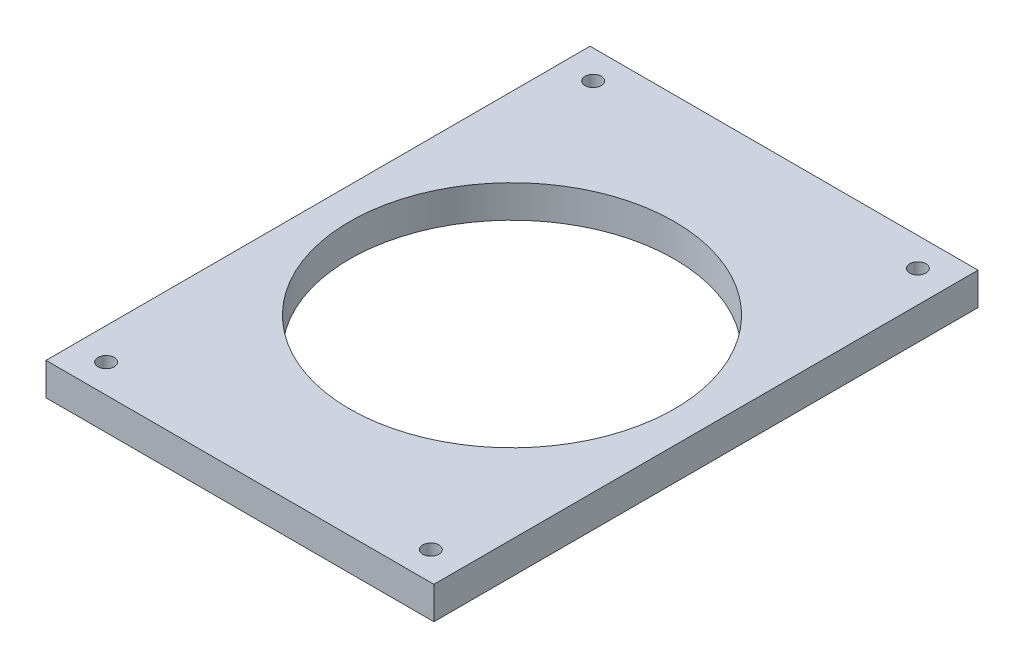
ISO-10303-21;
HEADER;
FILE_DESCRIPTION(('STEP AP214'),'2;1');
FILE_NAME('part.step','',(''),(''),'','','');
FILE_SCHEMA(('AUTOMOTIVE_DESIGN { 1 0 10303 214 1 1 1 1 }'));
ENDSEC;
DATA;
#1=APPLICATION_CONTEXT('core data for automotive mechanical design processes');
#2=APPLICATION_PROTOCOL_DEFINITION('international standard','automotive_design',2000,#1);
#3=PRODUCT_CONTEXT('',#1,'mechanical');
#4=PRODUCT('Part','Part','',(#3));
#5=PRODUCT_RELATED_PRODUCT_CATEGORY('part','',(#4));
#6=PRODUCT_DEFINITION_FORMATION('','',#4);
#7=PRODUCT_DEFINITION_CONTEXT('part definition',#1,'design');
#8=PRODUCT_DEFINITION('design','',#6,#7);
#9=PRODUCT_DEFINITION_SHAPE('','',#8);
#10=(LENGTH_UNIT() NAMED_UNIT(*) SI_UNIT(.MILLI.,.METRE.));
#11=(NAMED_UNIT(*) PLANE_ANGLE_UNIT() SI_UNIT($,.RADIAN.));
#12=(NAMED_UNIT(*) SI_UNIT($,.STERADIAN.) SOLID_ANGLE_UNIT());
#13=UNCERTAINTY_MEASURE_WITH_UNIT(LENGTH_MEASURE(1.E-05),#10,'distance_accuracy_value','');
#14=(GEOMETRIC_REPRESENTATION_CONTEXT(3) GLOBAL_UNCERTAINTY_ASSIGNED_CONTEXT((#13)) GLOBAL_UNIT_ASSIGNED_CONTEXT((#10,
#11,#12)) REPRESENTATION_CONTEXT('',''));
#15=CARTESIAN_POINT('',(0.,0.,0.));
#16=DIRECTION('',(0.,0.,1.));
#17=DIRECTION('',(1.,0.,0.));
#18=AXIS2_PLACEMENT_3D('',#15,#16,#17);
#19=CARTESIAN_POINT('',(0.,10.,0.));
#20=DIRECTION('',(0.,1.,0.));
#21=DIRECTION('',(0.,0.,1.));
#22=AXIS2_PLACEMENT_3D('',#19,#20,#21);
#23=PLANE('',#22);
#24=CARTESIAN_POINT('',(-50.,10.,75.));
#25=DIRECTION('',(0.,1.,0.));
#26=DIRECTION('',(0.,0.,1.));
#27=AXIS2_PLACEMENT_3D('',#24,#25,#26);
#28=CIRCLE('',#27,2.5);
#29=CARTESIAN_POINT('',(-50.,10.,77.5));
#30=VERTEX_POINT('',#29);
#31=EDGE_CURVE('E150',#30,#30,#28,.T.);
#32=ORIENTED_EDGE('',*,*,#31,.F.);
#33=EDGE_LOOP('',(#32));
#34=FACE_BOUND('',#33,.T.);
#35=CARTESIAN_POINT('',(50.,10.,-75.));
#36=DIRECTION('',(0.,1.,0.));
#37=DIRECTION('',(0.,0.,1.));
#38=AXIS2_PLACEMENT_3D('',#35,#36,#37);
#39=CIRCLE('',#38,2.5);
#40=CARTESIAN_POINT('',(50.,10.,-72.5));
#41=VERTEX_POINT('',#40);
#42=EDGE_CURVE('E134',#41,#41,#39,.T.);
#43=ORIENTED_EDGE('',*,*,#42,.F.);
#44=EDGE_LOOP('',(#43));
#45=FACE_BOUND('',#44,.T.);
#46=DIRECTION('',(0.,0.,-1.));
#47=VECTOR('',#46,1.);
#48=CARTESIAN_POINT('',(59.7348523186744,10.,-83.7865090278436));
#49=LINE('',#48,#47);
#50=CARTESIAN_POINT('',(59.7348523186744,10.,83.7865090278436));
#51=VERTEX_POINT('',#50);
#52=CARTESIAN_POINT('',(59.7348523186744,10.,-83.7865090278436));
#53=VERTEX_POINT('',#52);
#54=EDGE_CURVE('E92',#51,#53,#49,.T.);
#55=ORIENTED_EDGE('',*,*,#54,.T.);
#56=DIRECTION('',(-1.,0.,0.));
#57=VECTOR('',#56,1.);
#58=CARTESIAN_POINT('',(-59.7348523186744,10.,-83.7865090278436));
#59=LINE('',#58,#57);
#60=CARTESIAN_POINT('',(-59.7348523186744,10.,-83.7865090278436));
#61=VERTEX_POINT('',#60);
#62=EDGE_CURVE('E87',#53,#61,#59,.T.);
#63=ORIENTED_EDGE('',*,*,#62,.T.);
#64=DIRECTION('',(0.,0.,1.));
#65=VECTOR('',#64,1.);
#66=CARTESIAN_POINT('',(-59.7348523186744,10.,-83.7865090278436));
#67=LINE('',#66,#65);
#68=CARTESIAN_POINT('',(-59.7348523186744,10.,83.7865090278436));
#69=VERTEX_POINT('',#68);
#70=EDGE_CURVE('E90',#61,#69,#67,.T.);
#71=ORIENTED_EDGE('',*,*,#70,.T.);
#72=DIRECTION('',(1.,0.,0.));
#73=VECTOR('',#72,1.);
#74=CARTESIAN_POINT('',(-59.7348523186744,10.,83.7865090278436));
#75=LINE('',#74,#73);
#76=EDGE_CURVE('E57',#69,#51,#75,.T.);
#77=ORIENTED_EDGE('',*,*,#76,.T.);
#78=EDGE_LOOP('',(#55,#63,#71,#77));
#79=FACE_BOUND('',#78,.T.);
#80=CARTESIAN_POINT('',(0.,10.,0.));
#81=DIRECTION('',(0.,1.,0.));
#82=DIRECTION('',(0.,0.,1.));
#83=AXIS2_PLACEMENT_3D('',#80,#81,#82);
#84=CIRCLE('',#83,50.);
#85=CARTESIAN_POINT('',(0.,10.,50.));
#86=VERTEX_POINT('',#85);
#87=EDGE_CURVE('E112',#86,#86,#84,.T.);
#88=ORIENTED_EDGE('',*,*,#87,.F.);
#89=EDGE_LOOP('',(#88));
#90=FACE_BOUND('',#89,.T.);
#91=CARTESIAN_POINT('',(-50.,10.,-75.));
#92=DIRECTION('',(0.,1.,0.));
#93=DIRECTION('',(0.,0.,1.));
#94=AXIS2_PLACEMENT_3D('',#91,#92,#93);
#95=CIRCLE('',#94,2.5);
#96=CARTESIAN_POINT('',(-50.,10.,-72.5));
#97=VERTEX_POINT('',#96);
#98=EDGE_CURVE('E142',#97,#97,#95,.T.);
#99=ORIENTED_EDGE('',*,*,#98,.F.);
#100=EDGE_LOOP('',(#99));
#101=FACE_BOUND('',#100,.T.);
#102=CARTESIAN_POINT('',(50.,10.,75.));
#103=DIRECTION('',(0.,1.,0.));
#104=DIRECTION('',(0.,0.,1.));
#105=AXIS2_PLACEMENT_3D('',#102,#103,#104);
#106=CIRCLE('',#105,2.5);
#107=CARTESIAN_POINT('',(50.,10.,77.5));
#108=VERTEX_POINT('',#107);
#109=EDGE_CURVE('E158',#108,#108,#106,.T.);
#110=ORIENTED_EDGE('',*,*,#109,.F.);
#111=EDGE_LOOP('',(#110));
#112=FACE_BOUND('',#111,.T.);
#113=ADVANCED_FACE('F39',(#34,#45,#79,#90,#101,#112),#23,.T.);
#114=CARTESIAN_POINT('',(0.,0.,0.));
#115=DIRECTION('',(0.,1.,0.));
#116=DIRECTION('',(0.,0.,1.));
#117=AXIS2_PLACEMENT_3D('',#114,#115,#116);
#118=PLANE('',#117);
#119=DIRECTION('',(0.,0.,-1.));
#120=VECTOR('',#119,1.);
#121=CARTESIAN_POINT('',(59.7348523186744,0.,-83.7865090278436));
#122=LINE('',#121,#120);
#123=CARTESIAN_POINT('',(59.7348523186744,0.,83.7865090278436));
#124=VERTEX_POINT('',#123);
#125=CARTESIAN_POINT('',(59.7348523186744,0.,-83.7865090278436));
#126=VERTEX_POINT('',#125);
#127=EDGE_CURVE('E108',#124,#126,#122,.T.);
#128=ORIENTED_EDGE('',*,*,#127,.F.);
#129=DIRECTION('',(1.,0.,0.));
#130=VECTOR('',#129,1.);
#131=CARTESIAN_POINT('',(-59.7348523186744,0.,83.7865090278436));
#132=LINE('',#131,#130);
#133=CARTESIAN_POINT('',(-59.7348523186744,0.,83.7865090278436));
#134=VERTEX_POINT('',#133);
#135=EDGE_CURVE('E80',#134,#124,#132,.T.);
#136=ORIENTED_EDGE('',*,*,#135,.F.);
#137=DIRECTION('',(0.,0.,1.));
#138=VECTOR('',#137,1.);
#139=CARTESIAN_POINT('',(-59.7348523186744,0.,-83.7865090278436));
#140=LINE('',#139,#138);
#141=CARTESIAN_POINT('',(-59.7348523186744,0.,-83.7865090278436));
#142=VERTEX_POINT('',#141);
#143=EDGE_CURVE('E74',#142,#134,#140,.T.);
#144=ORIENTED_EDGE('',*,*,#143,.F.);
#145=DIRECTION('',(-1.,0.,0.));
#146=VECTOR('',#145,1.);
#147=CARTESIAN_POINT('',(-59.7348523186744,0.,-83.7865090278436));
#148=LINE('',#147,#146);
#149=EDGE_CURVE('E97',#126,#142,#148,.T.);
#150=ORIENTED_EDGE('',*,*,#149,.F.);
#151=EDGE_LOOP('',(#128,#136,#144,#150));
#152=FACE_BOUND('',#151,.T.);
#153=CARTESIAN_POINT('',(0.,0.,0.));
#154=DIRECTION('',(0.,1.,0.));
#155=DIRECTION('',(0.,0.,1.));
#156=AXIS2_PLACEMENT_3D('',#153,#154,#155);
#157=CIRCLE('',#156,50.);
#158=CARTESIAN_POINT('',(0.,0.,50.));
#159=VERTEX_POINT('',#158);
#160=EDGE_CURVE('E130',#159,#159,#157,.T.);
#161=ORIENTED_EDGE('',*,*,#160,.T.);
#162=EDGE_LOOP('',(#161));
#163=FACE_BOUND('',#162,.T.);
#164=CARTESIAN_POINT('',(50.,0.,-75.));
#165=DIRECTION('',(0.,1.,0.));
#166=DIRECTION('',(0.,0.,1.));
#167=AXIS2_PLACEMENT_3D('',#164,#165,#166);
#168=CIRCLE('',#167,2.5);
#169=CARTESIAN_POINT('',(50.,0.,-72.5));
#170=VERTEX_POINT('',#169);
#171=EDGE_CURVE('E138',#170,#170,#168,.T.);
#172=ORIENTED_EDGE('',*,*,#171,.T.);
#173=EDGE_LOOP('',(#172));
#174=FACE_BOUND('',#173,.T.);
#175=CARTESIAN_POINT('',(-50.,0.,-75.));
#176=DIRECTION('',(0.,1.,0.));
#177=DIRECTION('',(0.,0.,1.));
#178=AXIS2_PLACEMENT_3D('',#175,#176,#177);
#179=CIRCLE('',#178,2.5);
#180=CARTESIAN_POINT('',(-50.,0.,-72.5));
#181=VERTEX_POINT('',#180);
#182=EDGE_CURVE('E146',#181,#181,#179,.T.);
#183=ORIENTED_EDGE('',*,*,#182,.T.);
#184=EDGE_LOOP('',(#183));
#185=FACE_BOUND('',#184,.T.);
#186=CARTESIAN_POINT('',(-50.,0.,75.));
#187=DIRECTION('',(0.,1.,0.));
#188=DIRECTION('',(0.,0.,1.));
#189=AXIS2_PLACEMENT_3D('',#186,#187,#188);
#190=CIRCLE('',#189,2.5);
#191=CARTESIAN_POINT('',(-50.,0.,77.5));
#192=VERTEX_POINT('',#191);
#193=EDGE_CURVE('E154',#192,#192,#190,.T.);
#194=ORIENTED_EDGE('',*,*,#193,.T.);
#195=EDGE_LOOP('',(#194));
#196=FACE_BOUND('',#195,.T.);
#197=CARTESIAN_POINT('',(50.,0.,75.));
#198=DIRECTION('',(0.,1.,0.));
#199=DIRECTION('',(0.,0.,1.));
#200=AXIS2_PLACEMENT_3D('',#197,#198,#199);
#201=CIRCLE('',#200,2.5);
#202=CARTESIAN_POINT('',(50.,0.,77.5));
#203=VERTEX_POINT('',#202);
#204=EDGE_CURVE('E162',#203,#203,#201,.T.);
#205=ORIENTED_EDGE('',*,*,#204,.T.);
#206=EDGE_LOOP('',(#205));
#207=FACE_BOUND('',#206,.T.);
#208=ADVANCED_FACE('F125',(#152,#163,#174,#185,#196,#207),#118,.F.);
#209=CARTESIAN_POINT('',(59.7348523186744,10.,-83.7865090278436));
#210=DIRECTION('',(-1.,0.,0.));
#211=DIRECTION('',(0.,0.,1.));
#212=AXIS2_PLACEMENT_3D('',#209,#210,#211);
#213=PLANE('',#212);
#214=ORIENTED_EDGE('',*,*,#127,.T.);
#215=DIRECTION('',(0.,-1.,0.));
#216=VECTOR('',#215,1.);
#217=CARTESIAN_POINT('',(59.7348523186744,10.,-83.7865090278436));
#218=LINE('',#217,#216);
#219=EDGE_CURVE('E11',#53,#126,#218,.T.);
#220=ORIENTED_EDGE('',*,*,#219,.F.);
#221=ORIENTED_EDGE('',*,*,#54,.F.);
#222=DIRECTION('',(0.,-1.,0.));
#223=VECTOR('',#222,1.);
#224=CARTESIAN_POINT('',(59.7348523186744,10.,83.7865090278436));
#225=LINE('',#224,#223);
#226=EDGE_CURVE('E104',#51,#124,#225,.T.);
#227=ORIENTED_EDGE('',*,*,#226,.T.);
#228=EDGE_LOOP('',(#214,#220,#221,#227));
#229=FACE_BOUND('',#228,.T.);
#230=ADVANCED_FACE('F41',(#229),#213,.F.);
#231=CARTESIAN_POINT('',(-59.7348523186744,10.,-83.7865090278436));
#232=DIRECTION('',(0.,0.,1.));
#233=DIRECTION('',(1.,0.,0.));
#234=AXIS2_PLACEMENT_3D('',#231,#232,#233);
#235=PLANE('',#234);
#236=ORIENTED_EDGE('',*,*,#149,.T.);
#237=DIRECTION('',(0.,-1.,0.));
#238=VECTOR('',#237,1.);
#239=CARTESIAN_POINT('',(-59.7348523186744,10.,-83.7865090278436));
#240=LINE('',#239,#238);
#241=EDGE_CURVE('E49',#61,#142,#240,.T.);
#242=ORIENTED_EDGE('',*,*,#241,.F.);
#243=ORIENTED_EDGE('',*,*,#62,.F.);
#244=ORIENTED_EDGE('',*,*,#219,.T.);
#245=EDGE_LOOP('',(#236,#242,#243,#244));
#246=FACE_BOUND('',#245,.T.);
#247=ADVANCED_FACE('F96',(#246),#235,.F.);
#248=CARTESIAN_POINT('',(-59.7348523186744,10.,-83.7865090278436));
#249=DIRECTION('',(1.,0.,0.));
#250=DIRECTION('',(0.,0.,-1.));
#251=AXIS2_PLACEMENT_3D('',#248,#249,#250);
#252=PLANE('',#251);
#253=ORIENTED_EDGE('',*,*,#143,.T.);
#254=DIRECTION('',(0.,-1.,0.));
#255=VECTOR('',#254,1.);
#256=CARTESIAN_POINT('',(-59.7348523186744,10.,83.7865090278436));
#257=LINE('',#256,#255);
#258=EDGE_CURVE('E99',#69,#134,#257,.T.);
#259=ORIENTED_EDGE('',*,*,#258,.F.);
#260=ORIENTED_EDGE('',*,*,#70,.F.);
#261=ORIENTED_EDGE('',*,*,#241,.T.);
#262=EDGE_LOOP('',(#253,#259,#260,#261));
#263=FACE_BOUND('',#262,.T.);
#264=ADVANCED_FACE('F100',(#263),#252,.F.);
#265=CARTESIAN_POINT('',(-59.7348523186744,10.,83.7865090278436));
#266=DIRECTION('',(0.,0.,-1.));
#267=DIRECTION('',(-1.,0.,0.));
#268=AXIS2_PLACEMENT_3D('',#265,#266,#267);
#269=PLANE('',#268);
#270=ORIENTED_EDGE('',*,*,#135,.T.);
#271=ORIENTED_EDGE('',*,*,#226,.F.);
#272=ORIENTED_EDGE('',*,*,#76,.F.);
#273=ORIENTED_EDGE('',*,*,#258,.T.);
#274=EDGE_LOOP('',(#270,#271,#272,#273));
#275=FACE_BOUND('',#274,.T.);
#276=ADVANCED_FACE('F122',(#275),#269,.F.);
#277=CARTESIAN_POINT('',(0.,10.,0.));
#278=DIRECTION('',(0.,-1.,0.));
#279=DIRECTION('',(0.,0.,-1.));
#280=AXIS2_PLACEMENT_3D('',#277,#278,#279);
#281=CYLINDRICAL_SURFACE('',#280,50.);
#282=ORIENTED_EDGE('',*,*,#87,.T.);
#283=EDGE_LOOP('',(#282));
#284=FACE_BOUND('',#283,.T.);
#285=ORIENTED_EDGE('',*,*,#160,.F.);
#286=EDGE_LOOP('',(#285));
#287=FACE_BOUND('',#286,.T.);
#288=ADVANCED_FACE('F183',(#284,#287),#281,.F.);
#289=CARTESIAN_POINT('',(50.,10.,-75.));
#290=DIRECTION('',(0.,-1.,0.));
#291=DIRECTION('',(0.,0.,-1.));
#292=AXIS2_PLACEMENT_3D('',#289,#290,#291);
#293=CYLINDRICAL_SURFACE('',#292,2.5);
#294=ORIENTED_EDGE('',*,*,#42,.T.);
#295=EDGE_LOOP('',(#294));
#296=FACE_BOUND('',#295,.T.);
#297=ORIENTED_EDGE('',*,*,#171,.F.);
#298=EDGE_LOOP('',(#297));
#299=FACE_BOUND('',#298,.T.);
#300=ADVANCED_FACE('F229',(#296,#299),#293,.F.);
#301=CARTESIAN_POINT('',(-50.,10.,-75.));
#302=DIRECTION('',(0.,-1.,0.));
#303=DIRECTION('',(0.,0.,-1.));
#304=AXIS2_PLACEMENT_3D('',#301,#302,#303);
#305=CYLINDRICAL_SURFACE('',#304,2.5);
#306=ORIENTED_EDGE('',*,*,#98,.T.);
#307=EDGE_LOOP('',(#306));
#308=FACE_BOUND('',#307,.T.);
#309=ORIENTED_EDGE('',*,*,#182,.F.);
#310=EDGE_LOOP('',(#309));
#311=FACE_BOUND('',#310,.T.);
#312=ADVANCED_FACE('F237',(#308,#311),#305,.F.);
#313=CARTESIAN_POINT('',(-50.,10.,75.));
#314=DIRECTION('',(0.,-1.,0.));
#315=DIRECTION('',(0.,0.,-1.));
#316=AXIS2_PLACEMENT_3D('',#313,#314,#315);
#317=CYLINDRICAL_SURFACE('',#316,2.5);
#318=ORIENTED_EDGE('',*,*,#31,.T.);
#319=EDGE_LOOP('',(#318));
#320=FACE_BOUND('',#319,.T.);
#321=ORIENTED_EDGE('',*,*,#193,.F.);
#322=EDGE_LOOP('',(#321));
#323=FACE_BOUND('',#322,.T.);
#324=ADVANCED_FACE('F245',(#320,#323),#317,.F.);
#325=CARTESIAN_POINT('',(50.,10.,75.));
#326=DIRECTION('',(0.,-1.,0.));
#327=DIRECTION('',(0.,0.,-1.));
#328=AXIS2_PLACEMENT_3D('',#325,#326,#327);
#329=CYLINDRICAL_SURFACE('',#328,2.5);
#330=ORIENTED_EDGE('',*,*,#109,.T.);
#331=EDGE_LOOP('',(#330));
#332=FACE_BOUND('',#331,.T.);
#333=ORIENTED_EDGE('',*,*,#204,.F.);
#334=EDGE_LOOP('',(#333));
#335=FACE_BOUND('',#334,.T.);
#336=ADVANCED_FACE('F170',(#332,#335),#329,.F.);
#337=CLOSED_SHELL('',(#113,#208,#230,#247,#264,#276,#288,#300,#312,#324,#336));
#338=MANIFOLD_SOLID_BREP('B2',#337);
#339=ADVANCED_BREP_SHAPE_REPRESENTATION('',(#18,#338),#14);
#340=SHAPE_DEFINITION_REPRESENTATION(#9,#339);
ENDSEC;
END-ISO-10303-21;
